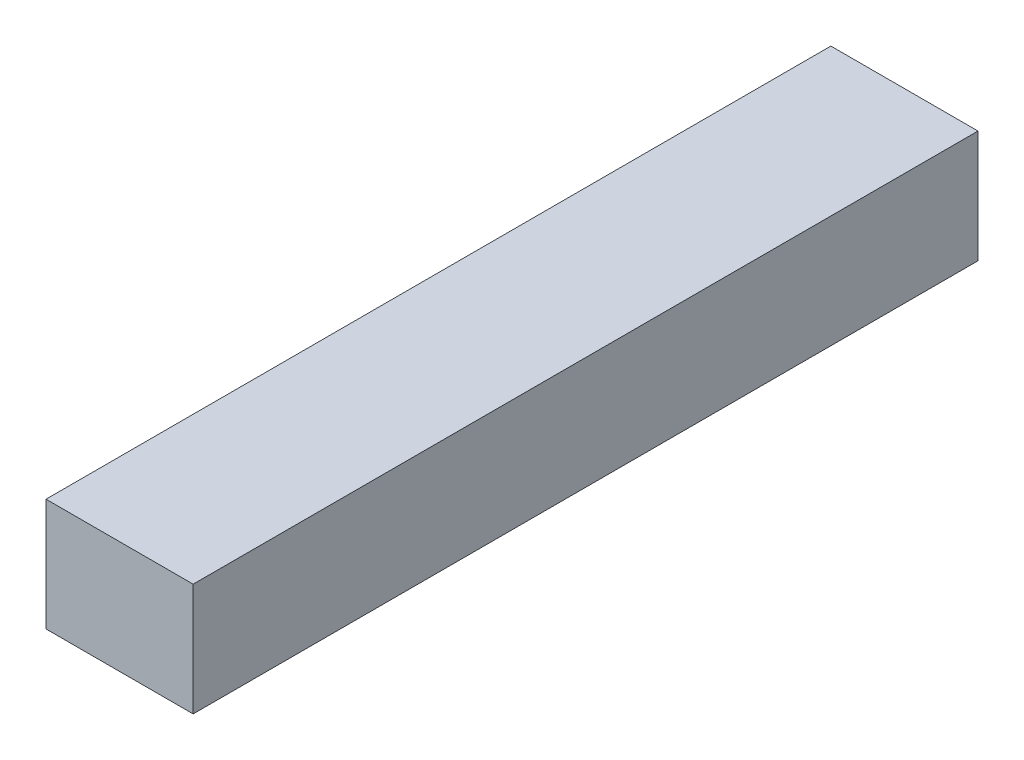
ISO-10303-21;
HEADER;
FILE_DESCRIPTION(('STEP AP214'),'2;1');
FILE_NAME('part.step','',(''),(''),'','','');
FILE_SCHEMA(('AUTOMOTIVE_DESIGN { 1 0 10303 214 1 1 1 1 }'));
ENDSEC;
DATA;
#1=APPLICATION_CONTEXT('core data for automotive mechanical design processes');
#2=APPLICATION_PROTOCOL_DEFINITION('international standard','automotive_design',2000,#1);
#3=PRODUCT_CONTEXT('',#1,'mechanical');
#4=PRODUCT('Part','Part','',(#3));
#5=PRODUCT_RELATED_PRODUCT_CATEGORY('part','',(#4));
#6=PRODUCT_DEFINITION_FORMATION('','',#4);
#7=PRODUCT_DEFINITION_CONTEXT('part definition',#1,'design');
#8=PRODUCT_DEFINITION('design','',#6,#7);
#9=PRODUCT_DEFINITION_SHAPE('','',#8);
#10=(LENGTH_UNIT() NAMED_UNIT(*) SI_UNIT(.MILLI.,.METRE.));
#11=(NAMED_UNIT(*) PLANE_ANGLE_UNIT() SI_UNIT($,.RADIAN.));
#12=(NAMED_UNIT(*) SI_UNIT($,.STERADIAN.) SOLID_ANGLE_UNIT());
#13=UNCERTAINTY_MEASURE_WITH_UNIT(LENGTH_MEASURE(1.E-05),#10,'distance_accuracy_value','');
#14=(GEOMETRIC_REPRESENTATION_CONTEXT(3) GLOBAL_UNCERTAINTY_ASSIGNED_CONTEXT((#13)) GLOBAL_UNIT_ASSIGNED_CONTEXT((#10,
#11,#12)) REPRESENTATION_CONTEXT('',''));
#15=CARTESIAN_POINT('',(0.,0.,0.));
#16=DIRECTION('',(0.,0.,1.));
#17=DIRECTION('',(1.,0.,0.));
#18=AXIS2_PLACEMENT_3D('',#15,#16,#17);
#19=CARTESIAN_POINT('',(6.,0.,32.));
#20=DIRECTION('',(0.,-1.,0.));
#21=DIRECTION('',(1.,0.,0.));
#22=AXIS2_PLACEMENT_3D('',#19,#20,#21);
#23=PLANE('',#22);
#24=DIRECTION('',(-1.,0.,0.));
#25=VECTOR('',#24,1.);
#26=CARTESIAN_POINT('',(6.,0.,0.));
#27=LINE('',#26,#25);
#28=CARTESIAN_POINT('',(6.,0.,0.));
#29=VERTEX_POINT('',#28);
#30=CARTESIAN_POINT('',(0.,0.,0.));
#31=VERTEX_POINT('',#30);
#32=EDGE_CURVE('E97',#29,#31,#27,.T.);
#33=ORIENTED_EDGE('',*,*,#32,.T.);
#34=DIRECTION('',(0.,0.,-1.));
#35=VECTOR('',#34,1.);
#36=CARTESIAN_POINT('',(0.,0.,32.));
#37=LINE('',#36,#35);
#38=CARTESIAN_POINT('',(0.,0.,32.));
#39=VERTEX_POINT('',#38);
#40=EDGE_CURVE('E11',#39,#31,#37,.T.);
#41=ORIENTED_EDGE('',*,*,#40,.F.);
#42=DIRECTION('',(-1.,0.,0.));
#43=VECTOR('',#42,1.);
#44=CARTESIAN_POINT('',(6.,0.,32.));
#45=LINE('',#44,#43);
#46=CARTESIAN_POINT('',(6.,0.,32.));
#47=VERTEX_POINT('',#46);
#48=EDGE_CURVE('E85',#47,#39,#45,.T.);
#49=ORIENTED_EDGE('',*,*,#48,.F.);
#50=DIRECTION('',(0.,0.,-1.));
#51=VECTOR('',#50,1.);
#52=CARTESIAN_POINT('',(6.,0.,32.));
#53=LINE('',#52,#51);
#54=EDGE_CURVE('E93',#47,#29,#53,.T.);
#55=ORIENTED_EDGE('',*,*,#54,.T.);
#56=EDGE_LOOP('',(#33,#41,#49,#55));
#57=FACE_BOUND('',#56,.T.);
#58=ADVANCED_FACE('F34',(#57),#23,.F.);
#59=CARTESIAN_POINT('',(0.,0.,32.));
#60=DIRECTION('',(1.,0.,0.));
#61=DIRECTION('',(0.,0.,-1.));
#62=AXIS2_PLACEMENT_3D('',#59,#60,#61);
#63=PLANE('',#62);
#64=DIRECTION('',(0.,-1.,0.));
#65=VECTOR('',#64,1.);
#66=CARTESIAN_POINT('',(0.,0.,0.));
#67=LINE('',#66,#65);
#68=CARTESIAN_POINT('',(0.,-4.583,0.));
#69=VERTEX_POINT('',#68);
#70=EDGE_CURVE('E89',#31,#69,#67,.T.);
#71=ORIENTED_EDGE('',*,*,#70,.T.);
#72=DIRECTION('',(0.,0.,-1.));
#73=VECTOR('',#72,1.);
#74=CARTESIAN_POINT('',(0.,-4.583,32.));
#75=LINE('',#74,#73);
#76=CARTESIAN_POINT('',(0.,-4.583,32.));
#77=VERTEX_POINT('',#76);
#78=EDGE_CURVE('E42',#77,#69,#75,.T.);
#79=ORIENTED_EDGE('',*,*,#78,.F.);
#80=DIRECTION('',(0.,-1.,0.));
#81=VECTOR('',#80,1.);
#82=CARTESIAN_POINT('',(0.,0.,32.));
#83=LINE('',#82,#81);
#84=EDGE_CURVE('E80',#39,#77,#83,.T.);
#85=ORIENTED_EDGE('',*,*,#84,.F.);
#86=ORIENTED_EDGE('',*,*,#40,.T.);
#87=EDGE_LOOP('',(#71,#79,#85,#86));
#88=FACE_BOUND('',#87,.T.);
#89=ADVANCED_FACE('F88',(#88),#63,.F.);
#90=CARTESIAN_POINT('',(0.,-4.583,32.));
#91=DIRECTION('',(0.,1.,0.));
#92=DIRECTION('',(0.,0.,1.));
#93=AXIS2_PLACEMENT_3D('',#90,#91,#92);
#94=PLANE('',#93);
#95=DIRECTION('',(1.,0.,0.));
#96=VECTOR('',#95,1.);
#97=CARTESIAN_POINT('',(0.,-4.583,0.));
#98=LINE('',#97,#96);
#99=CARTESIAN_POINT('',(6.,-4.583,0.));
#100=VERTEX_POINT('',#99);
#101=EDGE_CURVE('E67',#69,#100,#98,.T.);
#102=ORIENTED_EDGE('',*,*,#101,.T.);
#103=DIRECTION('',(0.,0.,-1.));
#104=VECTOR('',#103,1.);
#105=CARTESIAN_POINT('',(6.,-4.583,32.));
#106=LINE('',#105,#104);
#107=CARTESIAN_POINT('',(6.,-4.583,32.));
#108=VERTEX_POINT('',#107);
#109=EDGE_CURVE('E90',#108,#100,#106,.T.);
#110=ORIENTED_EDGE('',*,*,#109,.F.);
#111=DIRECTION('',(1.,0.,0.));
#112=VECTOR('',#111,1.);
#113=CARTESIAN_POINT('',(0.,-4.583,32.));
#114=LINE('',#113,#112);
#115=EDGE_CURVE('E83',#77,#108,#114,.T.);
#116=ORIENTED_EDGE('',*,*,#115,.F.);
#117=ORIENTED_EDGE('',*,*,#78,.T.);
#118=EDGE_LOOP('',(#102,#110,#116,#117));
#119=FACE_BOUND('',#118,.T.);
#120=ADVANCED_FACE('F91',(#119),#94,.F.);
#121=CARTESIAN_POINT('',(6.,-4.583,32.));
#122=DIRECTION('',(-1.,0.,0.));
#123=DIRECTION('',(0.,0.,1.));
#124=AXIS2_PLACEMENT_3D('',#121,#122,#123);
#125=PLANE('',#124);
#126=DIRECTION('',(0.,1.,0.));
#127=VECTOR('',#126,1.);
#128=CARTESIAN_POINT('',(6.,-4.583,0.));
#129=LINE('',#128,#127);
#130=EDGE_CURVE('E73',#100,#29,#129,.T.);
#131=ORIENTED_EDGE('',*,*,#130,.T.);
#132=ORIENTED_EDGE('',*,*,#54,.F.);
#133=DIRECTION('',(0.,1.,0.));
#134=VECTOR('',#133,1.);
#135=CARTESIAN_POINT('',(6.,-4.583,32.));
#136=LINE('',#135,#134);
#137=EDGE_CURVE('E50',#108,#47,#136,.T.);
#138=ORIENTED_EDGE('',*,*,#137,.F.);
#139=ORIENTED_EDGE('',*,*,#109,.T.);
#140=EDGE_LOOP('',(#131,#132,#138,#139));
#141=FACE_BOUND('',#140,.T.);
#142=ADVANCED_FACE('F104',(#141),#125,.F.);
#143=CARTESIAN_POINT('',(0.,0.,32.));
#144=DIRECTION('',(0.,0.,1.));
#145=DIRECTION('',(1.,0.,0.));
#146=AXIS2_PLACEMENT_3D('',#143,#144,#145);
#147=PLANE('',#146);
#148=ORIENTED_EDGE('',*,*,#48,.T.);
#149=ORIENTED_EDGE('',*,*,#84,.T.);
#150=ORIENTED_EDGE('',*,*,#115,.T.);
#151=ORIENTED_EDGE('',*,*,#137,.T.);
#152=EDGE_LOOP('',(#148,#149,#150,#151));
#153=FACE_BOUND('',#152,.T.);
#154=ADVANCED_FACE('F81',(#153),#147,.T.);
#155=CARTESIAN_POINT('',(0.,0.,0.));
#156=DIRECTION('',(0.,0.,1.));
#157=DIRECTION('',(1.,0.,0.));
#158=AXIS2_PLACEMENT_3D('',#155,#156,#157);
#159=PLANE('',#158);
#160=ORIENTED_EDGE('',*,*,#32,.F.);
#161=ORIENTED_EDGE('',*,*,#130,.F.);
#162=ORIENTED_EDGE('',*,*,#101,.F.);
#163=ORIENTED_EDGE('',*,*,#70,.F.);
#164=EDGE_LOOP('',(#160,#161,#162,#163));
#165=FACE_BOUND('',#164,.T.);
#166=ADVANCED_FACE('F107',(#165),#159,.F.);
#167=CLOSED_SHELL('',(#58,#89,#120,#142,#154,#166));
#168=MANIFOLD_SOLID_BREP('B2',#167);
#169=ADVANCED_BREP_SHAPE_REPRESENTATION('',(#18,#168),#14);
#170=SHAPE_DEFINITION_REPRESENTATION(#9,#169);
ENDSEC;
END-ISO-10303-21;
